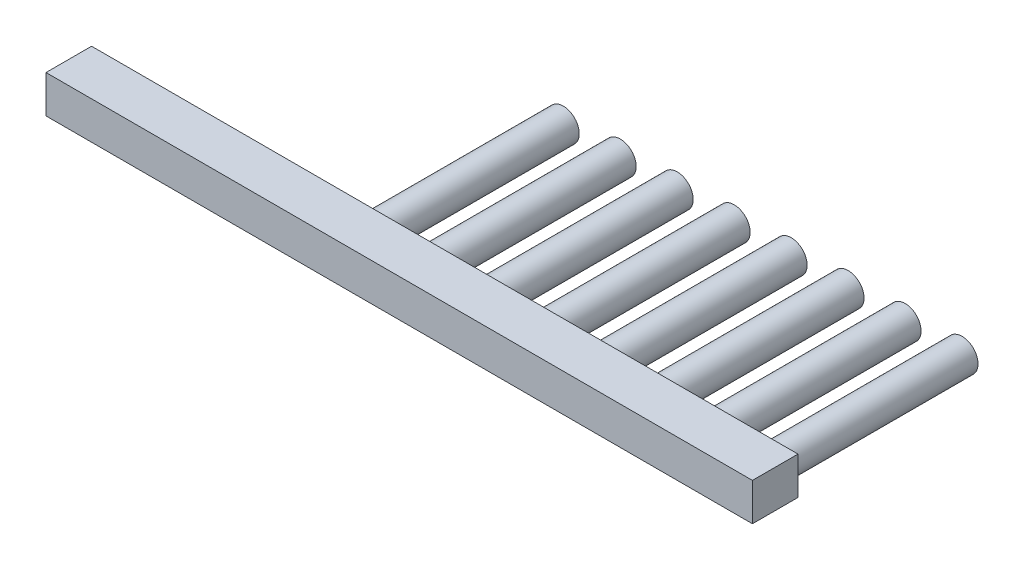
ISO-10303-21;
HEADER;
FILE_DESCRIPTION(('STEP AP214'),'2;1');
FILE_NAME('part.step','',(''),(''),'','','');
FILE_SCHEMA(('AUTOMOTIVE_DESIGN { 1 0 10303 214 1 1 1 1 }'));
ENDSEC;
DATA;
#1=APPLICATION_CONTEXT('core data for automotive mechanical design processes');
#2=APPLICATION_PROTOCOL_DEFINITION('international standard','automotive_design',2000,#1);
#3=PRODUCT_CONTEXT('',#1,'mechanical');
#4=PRODUCT('Part','Part','',(#3));
#5=PRODUCT_RELATED_PRODUCT_CATEGORY('part','',(#4));
#6=PRODUCT_DEFINITION_FORMATION('','',#4);
#7=PRODUCT_DEFINITION_CONTEXT('part definition',#1,'design');
#8=PRODUCT_DEFINITION('design','',#6,#7);
#9=PRODUCT_DEFINITION_SHAPE('','',#8);
#10=(LENGTH_UNIT() NAMED_UNIT(*) SI_UNIT(.MILLI.,.METRE.));
#11=(NAMED_UNIT(*) PLANE_ANGLE_UNIT() SI_UNIT($,.RADIAN.));
#12=(NAMED_UNIT(*) SI_UNIT($,.STERADIAN.) SOLID_ANGLE_UNIT());
#13=UNCERTAINTY_MEASURE_WITH_UNIT(LENGTH_MEASURE(1.E-05),#10,'distance_accuracy_value','');
#14=(GEOMETRIC_REPRESENTATION_CONTEXT(3) GLOBAL_UNCERTAINTY_ASSIGNED_CONTEXT((#13)) GLOBAL_UNIT_ASSIGNED_CONTEXT((#10,
#11,#12)) REPRESENTATION_CONTEXT('',''));
#15=CARTESIAN_POINT('',(0.,0.,0.));
#16=DIRECTION('',(0.,0.,1.));
#17=DIRECTION('',(1.,0.,0.));
#18=AXIS2_PLACEMENT_3D('',#15,#16,#17);
#19=CARTESIAN_POINT('',(-29.9999999999996,0.,-82.));
#20=DIRECTION('',(0.,0.,-1.));
#21=DIRECTION('',(-1.,0.,0.));
#22=AXIS2_PLACEMENT_3D('',#19,#20,#21);
#23=PLANE('',#22);
#24=CARTESIAN_POINT('',(-29.9999999999996,0.,-82.));
#25=DIRECTION('',(0.,0.,-1.));
#26=DIRECTION('',(-1.,0.,0.));
#27=AXIS2_PLACEMENT_3D('',#24,#25,#26);
#28=CIRCLE('',#27,7.00000000000001);
#29=CARTESIAN_POINT('',(-36.9999999999996,0.,-82.));
#30=VERTEX_POINT('',#29);
#31=EDGE_CURVE('E11',#30,#30,#28,.T.);
#32=ORIENTED_EDGE('',*,*,#31,.T.);
#33=EDGE_LOOP('',(#32));
#34=FACE_BOUND('',#33,.T.);
#35=ADVANCED_FACE('F33',(#34),#23,.T.);
#36=CARTESIAN_POINT('',(-29.9999999999996,0.,-82.));
#37=DIRECTION('',(0.,0.,1.));
#38=DIRECTION('',(1.,0.,0.));
#39=AXIS2_PLACEMENT_3D('',#36,#37,#38);
#40=CYLINDRICAL_SURFACE('',#39,7.00000000000001);
#41=ORIENTED_EDGE('',*,*,#31,.F.);
#42=EDGE_LOOP('',(#41));
#43=FACE_BOUND('',#42,.T.);
#44=CARTESIAN_POINT('',(-29.9999999999996,0.,0.));
#45=DIRECTION('',(0.,0.,-1.));
#46=DIRECTION('',(-1.,0.,0.));
#47=AXIS2_PLACEMENT_3D('',#44,#45,#46);
#48=CIRCLE('',#47,7.00000000000001);
#49=CARTESIAN_POINT('',(-36.9999999999996,0.,0.));
#50=VERTEX_POINT('',#49);
#51=EDGE_CURVE('E41',#50,#50,#48,.T.);
#52=ORIENTED_EDGE('',*,*,#51,.T.);
#53=EDGE_LOOP('',(#52));
#54=FACE_BOUND('',#53,.T.);
#55=ADVANCED_FACE('F142',(#43,#54),#40,.T.);
#56=CARTESIAN_POINT('',(-4.99999999999956,0.,-82.));
#57=DIRECTION('',(0.,0.,-1.));
#58=DIRECTION('',(-1.,0.,0.));
#59=AXIS2_PLACEMENT_3D('',#56,#57,#58);
#60=PLANE('',#59);
#61=CARTESIAN_POINT('',(-4.99999999999956,0.,-82.));
#62=DIRECTION('',(0.,0.,-1.));
#63=DIRECTION('',(-1.,0.,0.));
#64=AXIS2_PLACEMENT_3D('',#61,#62,#63);
#65=CIRCLE('',#64,7.00000000000001);
#66=CARTESIAN_POINT('',(-11.9999999999996,0.,-82.));
#67=VERTEX_POINT('',#66);
#68=EDGE_CURVE('E137',#67,#67,#65,.T.);
#69=ORIENTED_EDGE('',*,*,#68,.T.);
#70=EDGE_LOOP('',(#69));
#71=FACE_BOUND('',#70,.T.);
#72=ADVANCED_FACE('F166',(#71),#60,.T.);
#73=CARTESIAN_POINT('',(-4.99999999999956,0.,-82.));
#74=DIRECTION('',(0.,0.,1.));
#75=DIRECTION('',(1.,0.,0.));
#76=AXIS2_PLACEMENT_3D('',#73,#74,#75);
#77=CYLINDRICAL_SURFACE('',#76,7.00000000000001);
#78=ORIENTED_EDGE('',*,*,#68,.F.);
#79=EDGE_LOOP('',(#78));
#80=FACE_BOUND('',#79,.T.);
#81=CARTESIAN_POINT('',(-4.99999999999956,0.,0.));
#82=DIRECTION('',(0.,0.,-1.));
#83=DIRECTION('',(-1.,0.,0.));
#84=AXIS2_PLACEMENT_3D('',#81,#82,#83);
#85=CIRCLE('',#84,7.00000000000001);
#86=CARTESIAN_POINT('',(-11.9999999999996,0.,0.));
#87=VERTEX_POINT('',#86);
#88=EDGE_CURVE('E134',#87,#87,#85,.T.);
#89=ORIENTED_EDGE('',*,*,#88,.T.);
#90=EDGE_LOOP('',(#89));
#91=FACE_BOUND('',#90,.T.);
#92=ADVANCED_FACE('F172',(#80,#91),#77,.T.);
#93=CARTESIAN_POINT('',(20.0000000000005,0.,-82.));
#94=DIRECTION('',(0.,0.,-1.));
#95=DIRECTION('',(-1.,0.,0.));
#96=AXIS2_PLACEMENT_3D('',#93,#94,#95);
#97=PLANE('',#96);
#98=CARTESIAN_POINT('',(20.0000000000005,0.,-82.));
#99=DIRECTION('',(0.,0.,-1.));
#100=DIRECTION('',(-1.,0.,0.));
#101=AXIS2_PLACEMENT_3D('',#98,#99,#100);
#102=CIRCLE('',#101,7.00000000000001);
#103=CARTESIAN_POINT('',(13.0000000000004,0.,-82.));
#104=VERTEX_POINT('',#103);
#105=EDGE_CURVE('E131',#104,#104,#102,.T.);
#106=ORIENTED_EDGE('',*,*,#105,.T.);
#107=EDGE_LOOP('',(#106));
#108=FACE_BOUND('',#107,.T.);
#109=ADVANCED_FACE('F178',(#108),#97,.T.);
#110=CARTESIAN_POINT('',(20.0000000000005,0.,-82.));
#111=DIRECTION('',(0.,0.,1.));
#112=DIRECTION('',(1.,0.,0.));
#113=AXIS2_PLACEMENT_3D('',#110,#111,#112);
#114=CYLINDRICAL_SURFACE('',#113,7.00000000000001);
#115=ORIENTED_EDGE('',*,*,#105,.F.);
#116=EDGE_LOOP('',(#115));
#117=FACE_BOUND('',#116,.T.);
#118=CARTESIAN_POINT('',(20.0000000000005,0.,0.));
#119=DIRECTION('',(0.,0.,-1.));
#120=DIRECTION('',(-1.,0.,0.));
#121=AXIS2_PLACEMENT_3D('',#118,#119,#120);
#122=CIRCLE('',#121,7.00000000000001);
#123=CARTESIAN_POINT('',(13.0000000000004,0.,0.));
#124=VERTEX_POINT('',#123);
#125=EDGE_CURVE('E128',#124,#124,#122,.T.);
#126=ORIENTED_EDGE('',*,*,#125,.T.);
#127=EDGE_LOOP('',(#126));
#128=FACE_BOUND('',#127,.T.);
#129=ADVANCED_FACE('F182',(#117,#128),#114,.T.);
#130=CARTESIAN_POINT('',(45.0000000000005,0.,-82.));
#131=DIRECTION('',(0.,0.,-1.));
#132=DIRECTION('',(-1.,0.,0.));
#133=AXIS2_PLACEMENT_3D('',#130,#131,#132);
#134=PLANE('',#133);
#135=CARTESIAN_POINT('',(45.0000000000005,0.,-82.));
#136=DIRECTION('',(0.,0.,-1.));
#137=DIRECTION('',(-1.,0.,0.));
#138=AXIS2_PLACEMENT_3D('',#135,#136,#137);
#139=CIRCLE('',#138,7.00000000000001);
#140=CARTESIAN_POINT('',(38.0000000000004,0.,-82.));
#141=VERTEX_POINT('',#140);
#142=EDGE_CURVE('E125',#141,#141,#139,.T.);
#143=ORIENTED_EDGE('',*,*,#142,.T.);
#144=EDGE_LOOP('',(#143));
#145=FACE_BOUND('',#144,.T.);
#146=ADVANCED_FACE('F186',(#145),#134,.T.);
#147=CARTESIAN_POINT('',(45.0000000000005,0.,-82.));
#148=DIRECTION('',(0.,0.,1.));
#149=DIRECTION('',(1.,0.,0.));
#150=AXIS2_PLACEMENT_3D('',#147,#148,#149);
#151=CYLINDRICAL_SURFACE('',#150,7.00000000000001);
#152=ORIENTED_EDGE('',*,*,#142,.F.);
#153=EDGE_LOOP('',(#152));
#154=FACE_BOUND('',#153,.T.);
#155=CARTESIAN_POINT('',(45.0000000000005,0.,0.));
#156=DIRECTION('',(0.,0.,-1.));
#157=DIRECTION('',(-1.,0.,0.));
#158=AXIS2_PLACEMENT_3D('',#155,#156,#157);
#159=CIRCLE('',#158,7.00000000000001);
#160=CARTESIAN_POINT('',(38.0000000000004,0.,0.));
#161=VERTEX_POINT('',#160);
#162=EDGE_CURVE('E122',#161,#161,#159,.T.);
#163=ORIENTED_EDGE('',*,*,#162,.T.);
#164=EDGE_LOOP('',(#163));
#165=FACE_BOUND('',#164,.T.);
#166=ADVANCED_FACE('F190',(#154,#165),#151,.T.);
#167=CARTESIAN_POINT('',(70.0000000000005,0.,-82.));
#168=DIRECTION('',(0.,0.,-1.));
#169=DIRECTION('',(-1.,0.,0.));
#170=AXIS2_PLACEMENT_3D('',#167,#168,#169);
#171=PLANE('',#170);
#172=CARTESIAN_POINT('',(70.0000000000005,0.,-82.));
#173=DIRECTION('',(0.,0.,-1.));
#174=DIRECTION('',(-1.,0.,0.));
#175=AXIS2_PLACEMENT_3D('',#172,#173,#174);
#176=CIRCLE('',#175,7.00000000000001);
#177=CARTESIAN_POINT('',(63.0000000000004,0.,-82.));
#178=VERTEX_POINT('',#177);
#179=EDGE_CURVE('E119',#178,#178,#176,.T.);
#180=ORIENTED_EDGE('',*,*,#179,.T.);
#181=EDGE_LOOP('',(#180));
#182=FACE_BOUND('',#181,.T.);
#183=ADVANCED_FACE('F194',(#182),#171,.T.);
#184=CARTESIAN_POINT('',(70.0000000000005,0.,-82.));
#185=DIRECTION('',(0.,0.,1.));
#186=DIRECTION('',(1.,0.,0.));
#187=AXIS2_PLACEMENT_3D('',#184,#185,#186);
#188=CYLINDRICAL_SURFACE('',#187,7.00000000000001);
#189=ORIENTED_EDGE('',*,*,#179,.F.);
#190=EDGE_LOOP('',(#189));
#191=FACE_BOUND('',#190,.T.);
#192=CARTESIAN_POINT('',(70.0000000000005,0.,0.));
#193=DIRECTION('',(0.,0.,-1.));
#194=DIRECTION('',(-1.,0.,0.));
#195=AXIS2_PLACEMENT_3D('',#192,#193,#194);
#196=CIRCLE('',#195,7.00000000000001);
#197=CARTESIAN_POINT('',(63.0000000000004,0.,0.));
#198=VERTEX_POINT('',#197);
#199=EDGE_CURVE('E116',#198,#198,#196,.T.);
#200=ORIENTED_EDGE('',*,*,#199,.T.);
#201=EDGE_LOOP('',(#200));
#202=FACE_BOUND('',#201,.T.);
#203=ADVANCED_FACE('F198',(#191,#202),#188,.T.);
#204=CARTESIAN_POINT('',(95.0000000000005,0.,-82.));
#205=DIRECTION('',(0.,0.,-1.));
#206=DIRECTION('',(-1.,0.,0.));
#207=AXIS2_PLACEMENT_3D('',#204,#205,#206);
#208=PLANE('',#207);
#209=CARTESIAN_POINT('',(95.0000000000005,0.,-82.));
#210=DIRECTION('',(0.,0.,-1.));
#211=DIRECTION('',(-1.,0.,0.));
#212=AXIS2_PLACEMENT_3D('',#209,#210,#211);
#213=CIRCLE('',#212,7.00000000000001);
#214=CARTESIAN_POINT('',(88.0000000000005,0.,-82.));
#215=VERTEX_POINT('',#214);
#216=EDGE_CURVE('E113',#215,#215,#213,.T.);
#217=ORIENTED_EDGE('',*,*,#216,.T.);
#218=EDGE_LOOP('',(#217));
#219=FACE_BOUND('',#218,.T.);
#220=ADVANCED_FACE('F202',(#219),#208,.T.);
#221=CARTESIAN_POINT('',(95.0000000000005,0.,-82.));
#222=DIRECTION('',(0.,0.,1.));
#223=DIRECTION('',(1.,0.,0.));
#224=AXIS2_PLACEMENT_3D('',#221,#222,#223);
#225=CYLINDRICAL_SURFACE('',#224,7.00000000000001);
#226=ORIENTED_EDGE('',*,*,#216,.F.);
#227=EDGE_LOOP('',(#226));
#228=FACE_BOUND('',#227,.T.);
#229=CARTESIAN_POINT('',(95.0000000000005,0.,0.));
#230=DIRECTION('',(0.,0.,-1.));
#231=DIRECTION('',(-1.,0.,0.));
#232=AXIS2_PLACEMENT_3D('',#229,#230,#231);
#233=CIRCLE('',#232,7.00000000000001);
#234=CARTESIAN_POINT('',(88.0000000000005,0.,0.));
#235=VERTEX_POINT('',#234);
#236=EDGE_CURVE('E110',#235,#235,#233,.T.);
#237=ORIENTED_EDGE('',*,*,#236,.T.);
#238=EDGE_LOOP('',(#237));
#239=FACE_BOUND('',#238,.T.);
#240=ADVANCED_FACE('F206',(#228,#239),#225,.T.);
#241=CARTESIAN_POINT('',(155.,8.25000000000003,20.));
#242=DIRECTION('',(-1.,0.,0.));
#243=DIRECTION('',(0.,0.,1.));
#244=AXIS2_PLACEMENT_3D('',#241,#242,#243);
#245=PLANE('',#244);
#246=DIRECTION('',(0.,1.,0.));
#247=VECTOR('',#246,1.);
#248=CARTESIAN_POINT('',(155.,8.25000000000003,0.));
#249=LINE('',#248,#247);
#250=CARTESIAN_POINT('',(155.,-8.24999999999997,0.));
#251=VERTEX_POINT('',#250);
#252=CARTESIAN_POINT('',(155.,8.25000000000003,0.));
#253=VERTEX_POINT('',#252);
#254=EDGE_CURVE('E100',#251,#253,#249,.T.);
#255=ORIENTED_EDGE('',*,*,#254,.T.);
#256=DIRECTION('',(0.,0.,-1.));
#257=VECTOR('',#256,1.);
#258=CARTESIAN_POINT('',(155.,8.25000000000003,20.));
#259=LINE('',#258,#257);
#260=CARTESIAN_POINT('',(155.,8.25000000000003,20.));
#261=VERTEX_POINT('',#260);
#262=EDGE_CURVE('E91',#261,#253,#259,.T.);
#263=ORIENTED_EDGE('',*,*,#262,.F.);
#264=DIRECTION('',(0.,1.,0.));
#265=VECTOR('',#264,1.);
#266=CARTESIAN_POINT('',(155.,8.25000000000003,20.));
#267=LINE('',#266,#265);
#268=CARTESIAN_POINT('',(155.,-8.24999999999997,20.));
#269=VERTEX_POINT('',#268);
#270=EDGE_CURVE('E85',#269,#261,#267,.T.);
#271=ORIENTED_EDGE('',*,*,#270,.F.);
#272=DIRECTION('',(0.,0.,-1.));
#273=VECTOR('',#272,1.);
#274=CARTESIAN_POINT('',(155.,-8.24999999999997,20.));
#275=LINE('',#274,#273);
#276=EDGE_CURVE('E96',#269,#251,#275,.T.);
#277=ORIENTED_EDGE('',*,*,#276,.T.);
#278=EDGE_LOOP('',(#255,#263,#271,#277));
#279=FACE_BOUND('',#278,.T.);
#280=ADVANCED_FACE('F210',(#279),#245,.F.);
#281=CARTESIAN_POINT('',(155.,8.25000000000003,20.));
#282=DIRECTION('',(0.,-1.,0.));
#283=DIRECTION('',(1.,0.,0.));
#284=AXIS2_PLACEMENT_3D('',#281,#282,#283);
#285=PLANE('',#284);
#286=DIRECTION('',(-1.,0.,0.));
#287=VECTOR('',#286,1.);
#288=CARTESIAN_POINT('',(155.,8.25000000000003,0.));
#289=LINE('',#288,#287);
#290=CARTESIAN_POINT('',(-155.,8.24999999999999,0.));
#291=VERTEX_POINT('',#290);
#292=EDGE_CURVE('E90',#253,#291,#289,.T.);
#293=ORIENTED_EDGE('',*,*,#292,.T.);
#294=DIRECTION('',(0.,0.,-1.));
#295=VECTOR('',#294,1.);
#296=CARTESIAN_POINT('',(-155.,8.24999999999999,20.));
#297=LINE('',#296,#295);
#298=CARTESIAN_POINT('',(-155.,8.24999999999999,20.));
#299=VERTEX_POINT('',#298);
#300=EDGE_CURVE('E88',#299,#291,#297,.T.);
#301=ORIENTED_EDGE('',*,*,#300,.F.);
#302=DIRECTION('',(-1.,0.,0.));
#303=VECTOR('',#302,1.);
#304=CARTESIAN_POINT('',(155.,8.25000000000003,20.));
#305=LINE('',#304,#303);
#306=EDGE_CURVE('E80',#261,#299,#305,.T.);
#307=ORIENTED_EDGE('',*,*,#306,.F.);
#308=ORIENTED_EDGE('',*,*,#262,.T.);
#309=EDGE_LOOP('',(#293,#301,#307,#308));
#310=FACE_BOUND('',#309,.T.);
#311=ADVANCED_FACE('F89',(#310),#285,.F.);
#312=CARTESIAN_POINT('',(-155.,8.24999999999999,20.));
#313=DIRECTION('',(1.,0.,0.));
#314=DIRECTION('',(0.,0.,-1.));
#315=AXIS2_PLACEMENT_3D('',#312,#313,#314);
#316=PLANE('',#315);
#317=DIRECTION('',(0.,-1.,0.));
#318=VECTOR('',#317,1.);
#319=CARTESIAN_POINT('',(-155.,8.24999999999999,0.));
#320=LINE('',#319,#318);
#321=CARTESIAN_POINT('',(-155.,-8.25000000000001,0.));
#322=VERTEX_POINT('',#321);
#323=EDGE_CURVE('E66',#291,#322,#320,.T.);
#324=ORIENTED_EDGE('',*,*,#323,.T.);
#325=DIRECTION('',(0.,0.,-1.));
#326=VECTOR('',#325,1.);
#327=CARTESIAN_POINT('',(-155.,-8.25000000000001,20.));
#328=LINE('',#327,#326);
#329=CARTESIAN_POINT('',(-155.,-8.25000000000001,20.));
#330=VERTEX_POINT('',#329);
#331=EDGE_CURVE('E92',#330,#322,#328,.T.);
#332=ORIENTED_EDGE('',*,*,#331,.F.);
#333=DIRECTION('',(0.,-1.,0.));
#334=VECTOR('',#333,1.);
#335=CARTESIAN_POINT('',(-155.,8.24999999999999,20.));
#336=LINE('',#335,#334);
#337=EDGE_CURVE('E83',#299,#330,#336,.T.);
#338=ORIENTED_EDGE('',*,*,#337,.F.);
#339=ORIENTED_EDGE('',*,*,#300,.T.);
#340=EDGE_LOOP('',(#324,#332,#338,#339));
#341=FACE_BOUND('',#340,.T.);
#342=ADVANCED_FACE('F94',(#341),#316,.F.);
#343=CARTESIAN_POINT('',(155.,-8.24999999999997,20.));
#344=DIRECTION('',(0.,1.,0.));
#345=DIRECTION('',(-1.,0.,0.));
#346=AXIS2_PLACEMENT_3D('',#343,#344,#345);
#347=PLANE('',#346);
#348=DIRECTION('',(1.,0.,0.));
#349=VECTOR('',#348,1.);
#350=CARTESIAN_POINT('',(155.,-8.24999999999997,0.));
#351=LINE('',#350,#349);
#352=EDGE_CURVE('E72',#322,#251,#351,.T.);
#353=ORIENTED_EDGE('',*,*,#352,.T.);
#354=ORIENTED_EDGE('',*,*,#276,.F.);
#355=DIRECTION('',(1.,0.,0.));
#356=VECTOR('',#355,1.);
#357=CARTESIAN_POINT('',(155.,-8.24999999999997,20.));
#358=LINE('',#357,#356);
#359=EDGE_CURVE('E49',#330,#269,#358,.T.);
#360=ORIENTED_EDGE('',*,*,#359,.F.);
#361=ORIENTED_EDGE('',*,*,#331,.T.);
#362=EDGE_LOOP('',(#353,#354,#360,#361));
#363=FACE_BOUND('',#362,.T.);
#364=ADVANCED_FACE('F156',(#363),#347,.F.);
#365=CARTESIAN_POINT('',(0.,0.,20.));
#366=DIRECTION('',(0.,0.,-1.));
#367=DIRECTION('',(-1.,0.,0.));
#368=AXIS2_PLACEMENT_3D('',#365,#366,#367);
#369=PLANE('',#368);
#370=ORIENTED_EDGE('',*,*,#270,.T.);
#371=ORIENTED_EDGE('',*,*,#306,.T.);
#372=ORIENTED_EDGE('',*,*,#337,.T.);
#373=ORIENTED_EDGE('',*,*,#359,.T.);
#374=EDGE_LOOP('',(#370,#371,#372,#373));
#375=FACE_BOUND('',#374,.T.);
#376=ADVANCED_FACE('F81',(#375),#369,.F.);
#377=CARTESIAN_POINT('',(0.,0.,0.));
#378=DIRECTION('',(0.,0.,-1.));
#379=DIRECTION('',(-1.,0.,0.));
#380=AXIS2_PLACEMENT_3D('',#377,#378,#379);
#381=PLANE('',#380);
#382=CARTESIAN_POINT('',(120.,0.,0.));
#383=DIRECTION('',(0.,0.,-1.));
#384=DIRECTION('',(-1.,0.,0.));
#385=AXIS2_PLACEMENT_3D('',#382,#383,#384);
#386=CIRCLE('',#385,7.00000000000001);
#387=CARTESIAN_POINT('',(113.,0.,0.));
#388=VERTEX_POINT('',#387);
#389=EDGE_CURVE('E342',#388,#388,#386,.T.);
#390=ORIENTED_EDGE('',*,*,#389,.F.);
#391=EDGE_LOOP('',(#390));
#392=FACE_BOUND('',#391,.T.);
#393=CARTESIAN_POINT('',(145.,0.,0.));
#394=DIRECTION('',(0.,0.,-1.));
#395=DIRECTION('',(-1.,0.,0.));
#396=AXIS2_PLACEMENT_3D('',#393,#394,#395);
#397=CIRCLE('',#396,7.00000000000001);
#398=CARTESIAN_POINT('',(138.,0.,0.));
#399=VERTEX_POINT('',#398);
#400=EDGE_CURVE('E341',#399,#399,#397,.T.);
#401=ORIENTED_EDGE('',*,*,#400,.F.);
#402=EDGE_LOOP('',(#401));
#403=FACE_BOUND('',#402,.T.);
#404=ORIENTED_EDGE('',*,*,#254,.F.);
#405=ORIENTED_EDGE('',*,*,#352,.F.);
#406=ORIENTED_EDGE('',*,*,#323,.F.);
#407=ORIENTED_EDGE('',*,*,#292,.F.);
#408=EDGE_LOOP('',(#404,#405,#406,#407));
#409=FACE_BOUND('',#408,.T.);
#410=ORIENTED_EDGE('',*,*,#236,.F.);
#411=EDGE_LOOP('',(#410));
#412=FACE_BOUND('',#411,.T.);
#413=ORIENTED_EDGE('',*,*,#199,.F.);
#414=EDGE_LOOP('',(#413));
#415=FACE_BOUND('',#414,.T.);
#416=ORIENTED_EDGE('',*,*,#162,.F.);
#417=EDGE_LOOP('',(#416));
#418=FACE_BOUND('',#417,.T.);
#419=ORIENTED_EDGE('',*,*,#125,.F.);
#420=EDGE_LOOP('',(#419));
#421=FACE_BOUND('',#420,.T.);
#422=ORIENTED_EDGE('',*,*,#88,.F.);
#423=EDGE_LOOP('',(#422));
#424=FACE_BOUND('',#423,.T.);
#425=ORIENTED_EDGE('',*,*,#51,.F.);
#426=EDGE_LOOP('',(#425));
#427=FACE_BOUND('',#426,.T.);
#428=ADVANCED_FACE('F144',(#392,#403,#409,#412,#415,#418,#421,#424,#427),#381,.T.);
#429=CARTESIAN_POINT('',(145.,0.,-82.));
#430=DIRECTION('',(0.,0.,1.));
#431=DIRECTION('',(1.,0.,0.));
#432=AXIS2_PLACEMENT_3D('',#429,#430,#431);
#433=CYLINDRICAL_SURFACE('',#432,7.00000000000001);
#434=CARTESIAN_POINT('',(145.,0.,-82.));
#435=DIRECTION('',(0.,0.,-1.));
#436=DIRECTION('',(-1.,0.,0.));
#437=AXIS2_PLACEMENT_3D('',#434,#435,#436);
#438=CIRCLE('',#437,7.00000000000001);
#439=CARTESIAN_POINT('',(138.,0.,-82.));
#440=VERTEX_POINT('',#439);
#441=EDGE_CURVE('E103',#440,#440,#438,.T.);
#442=ORIENTED_EDGE('',*,*,#441,.F.);
#443=EDGE_LOOP('',(#442));
#444=FACE_BOUND('',#443,.T.);
#445=ORIENTED_EDGE('',*,*,#400,.T.);
#446=EDGE_LOOP('',(#445));
#447=FACE_BOUND('',#446,.T.);
#448=ADVANCED_FACE('F146',(#444,#447),#433,.T.);
#449=CARTESIAN_POINT('',(145.,0.,-82.));
#450=DIRECTION('',(0.,0.,-1.));
#451=DIRECTION('',(-1.,0.,0.));
#452=AXIS2_PLACEMENT_3D('',#449,#450,#451);
#453=PLANE('',#452);
#454=ORIENTED_EDGE('',*,*,#441,.T.);
#455=EDGE_LOOP('',(#454));
#456=FACE_BOUND('',#455,.T.);
#457=ADVANCED_FACE('F153',(#456),#453,.T.);
#458=CARTESIAN_POINT('',(120.,0.,-82.));
#459=DIRECTION('',(0.,0.,1.));
#460=DIRECTION('',(1.,0.,0.));
#461=AXIS2_PLACEMENT_3D('',#458,#459,#460);
#462=CYLINDRICAL_SURFACE('',#461,7.00000000000001);
#463=CARTESIAN_POINT('',(120.,0.,-82.));
#464=DIRECTION('',(0.,0.,-1.));
#465=DIRECTION('',(-1.,0.,0.));
#466=AXIS2_PLACEMENT_3D('',#463,#464,#465);
#467=CIRCLE('',#466,7.00000000000001);
#468=CARTESIAN_POINT('',(113.,0.,-82.));
#469=VERTEX_POINT('',#468);
#470=EDGE_CURVE('E340',#469,#469,#467,.T.);
#471=ORIENTED_EDGE('',*,*,#470,.F.);
#472=EDGE_LOOP('',(#471));
#473=FACE_BOUND('',#472,.T.);
#474=ORIENTED_EDGE('',*,*,#389,.T.);
#475=EDGE_LOOP('',(#474));
#476=FACE_BOUND('',#475,.T.);
#477=ADVANCED_FACE('F242',(#473,#476),#462,.T.);
#478=CARTESIAN_POINT('',(120.,0.,-82.));
#479=DIRECTION('',(0.,0.,-1.));
#480=DIRECTION('',(-1.,0.,0.));
#481=AXIS2_PLACEMENT_3D('',#478,#479,#480);
#482=PLANE('',#481);
#483=ORIENTED_EDGE('',*,*,#470,.T.);
#484=EDGE_LOOP('',(#483));
#485=FACE_BOUND('',#484,.T.);
#486=ADVANCED_FACE('F324',(#485),#482,.T.);
#487=CLOSED_SHELL('',(#35,#55,#72,#92,#109,#129,#146,#166,#183,#203,#220,#240,#280,#311,#342,
#364,#376,#428,#448,#457,#477,#486));
#488=MANIFOLD_SOLID_BREP('B2',#487);
#489=ADVANCED_BREP_SHAPE_REPRESENTATION('',(#18,#488),#14);
#490=SHAPE_DEFINITION_REPRESENTATION(#9,#489);
ENDSEC;
END-ISO-10303-21;
